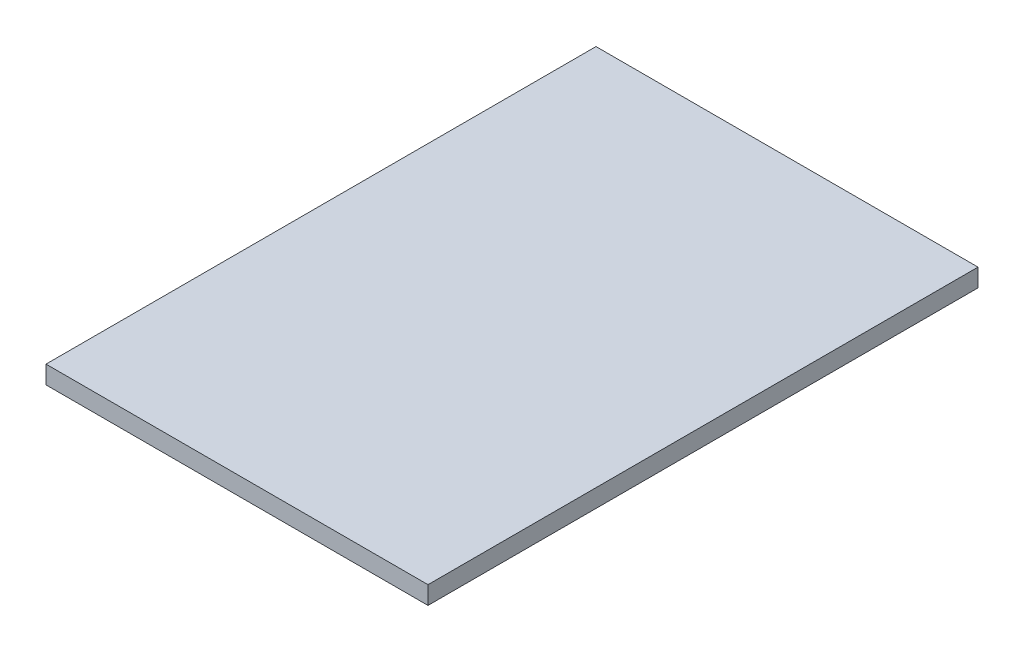
ISO-10303-21;
HEADER;
FILE_DESCRIPTION(('STEP AP214'),'2;1');
FILE_NAME('part.step','',(''),(''),'','','');
FILE_SCHEMA(('AUTOMOTIVE_DESIGN { 1 0 10303 214 1 1 1 1 }'));
ENDSEC;
DATA;
#1=APPLICATION_CONTEXT('core data for automotive mechanical design processes');
#2=APPLICATION_PROTOCOL_DEFINITION('international standard','automotive_design',2000,#1);
#3=PRODUCT_CONTEXT('',#1,'mechanical');
#4=PRODUCT('Part','Part','',(#3));
#5=PRODUCT_RELATED_PRODUCT_CATEGORY('part','',(#4));
#6=PRODUCT_DEFINITION_FORMATION('','',#4);
#7=PRODUCT_DEFINITION_CONTEXT('part definition',#1,'design');
#8=PRODUCT_DEFINITION('design','',#6,#7);
#9=PRODUCT_DEFINITION_SHAPE('','',#8);
#10=(LENGTH_UNIT() NAMED_UNIT(*) SI_UNIT(.MILLI.,.METRE.));
#11=(NAMED_UNIT(*) PLANE_ANGLE_UNIT() SI_UNIT($,.RADIAN.));
#12=(NAMED_UNIT(*) SI_UNIT($,.STERADIAN.) SOLID_ANGLE_UNIT());
#13=UNCERTAINTY_MEASURE_WITH_UNIT(LENGTH_MEASURE(1.E-05),#10,'distance_accuracy_value','');
#14=(GEOMETRIC_REPRESENTATION_CONTEXT(3) GLOBAL_UNCERTAINTY_ASSIGNED_CONTEXT((#13)) GLOBAL_UNIT_ASSIGNED_CONTEXT((#10,
#11,#12)) REPRESENTATION_CONTEXT('',''));
#15=CARTESIAN_POINT('',(0.,0.,0.));
#16=DIRECTION('',(0.,0.,1.));
#17=DIRECTION('',(1.,0.,0.));
#18=AXIS2_PLACEMENT_3D('',#15,#16,#17);
#19=CARTESIAN_POINT('',(191.,18.,-275.));
#20=DIRECTION('',(-1.,0.,0.));
#21=DIRECTION('',(0.,0.,1.));
#22=AXIS2_PLACEMENT_3D('',#19,#20,#21);
#23=PLANE('',#22);
#24=DIRECTION('',(0.,0.,-1.));
#25=VECTOR('',#24,1.);
#26=CARTESIAN_POINT('',(191.,0.,-275.));
#27=LINE('',#26,#25);
#28=CARTESIAN_POINT('',(191.,0.,275.));
#29=VERTEX_POINT('',#28);
#30=CARTESIAN_POINT('',(191.,0.,-275.));
#31=VERTEX_POINT('',#30);
#32=EDGE_CURVE('E96',#29,#31,#27,.T.);
#33=ORIENTED_EDGE('',*,*,#32,.T.);
#34=DIRECTION('',(0.,-1.,0.));
#35=VECTOR('',#34,1.);
#36=CARTESIAN_POINT('',(191.,18.,-275.));
#37=LINE('',#36,#35);
#38=CARTESIAN_POINT('',(191.,18.,-275.));
#39=VERTEX_POINT('',#38);
#40=EDGE_CURVE('E11',#39,#31,#37,.T.);
#41=ORIENTED_EDGE('',*,*,#40,.F.);
#42=DIRECTION('',(0.,0.,-1.));
#43=VECTOR('',#42,1.);
#44=CARTESIAN_POINT('',(191.,18.,-275.));
#45=LINE('',#44,#43);
#46=CARTESIAN_POINT('',(191.,18.,275.));
#47=VERTEX_POINT('',#46);
#48=EDGE_CURVE('E84',#47,#39,#45,.T.);
#49=ORIENTED_EDGE('',*,*,#48,.F.);
#50=DIRECTION('',(0.,-1.,0.));
#51=VECTOR('',#50,1.);
#52=CARTESIAN_POINT('',(191.,18.,275.));
#53=LINE('',#52,#51);
#54=EDGE_CURVE('E92',#47,#29,#53,.T.);
#55=ORIENTED_EDGE('',*,*,#54,.T.);
#56=EDGE_LOOP('',(#33,#41,#49,#55));
#57=FACE_BOUND('',#56,.T.);
#58=ADVANCED_FACE('F33',(#57),#23,.F.);
#59=CARTESIAN_POINT('',(-191.,18.,-275.));
#60=DIRECTION('',(0.,0.,1.));
#61=DIRECTION('',(1.,0.,0.));
#62=AXIS2_PLACEMENT_3D('',#59,#60,#61);
#63=PLANE('',#62);
#64=DIRECTION('',(-1.,0.,0.));
#65=VECTOR('',#64,1.);
#66=CARTESIAN_POINT('',(-191.,0.,-275.));
#67=LINE('',#66,#65);
#68=CARTESIAN_POINT('',(-191.,0.,-275.));
#69=VERTEX_POINT('',#68);
#70=EDGE_CURVE('E88',#31,#69,#67,.T.);
#71=ORIENTED_EDGE('',*,*,#70,.T.);
#72=DIRECTION('',(0.,-1.,0.));
#73=VECTOR('',#72,1.);
#74=CARTESIAN_POINT('',(-191.,18.,-275.));
#75=LINE('',#74,#73);
#76=CARTESIAN_POINT('',(-191.,18.,-275.));
#77=VERTEX_POINT('',#76);
#78=EDGE_CURVE('E41',#77,#69,#75,.T.);
#79=ORIENTED_EDGE('',*,*,#78,.F.);
#80=DIRECTION('',(-1.,0.,0.));
#81=VECTOR('',#80,1.);
#82=CARTESIAN_POINT('',(-191.,18.,-275.));
#83=LINE('',#82,#81);
#84=EDGE_CURVE('E79',#39,#77,#83,.T.);
#85=ORIENTED_EDGE('',*,*,#84,.F.);
#86=ORIENTED_EDGE('',*,*,#40,.T.);
#87=EDGE_LOOP('',(#71,#79,#85,#86));
#88=FACE_BOUND('',#87,.T.);
#89=ADVANCED_FACE('F87',(#88),#63,.F.);
#90=CARTESIAN_POINT('',(-191.,18.,-275.));
#91=DIRECTION('',(1.,0.,0.));
#92=DIRECTION('',(0.,0.,-1.));
#93=AXIS2_PLACEMENT_3D('',#90,#91,#92);
#94=PLANE('',#93);
#95=DIRECTION('',(0.,0.,1.));
#96=VECTOR('',#95,1.);
#97=CARTESIAN_POINT('',(-191.,0.,-275.));
#98=LINE('',#97,#96);
#99=CARTESIAN_POINT('',(-191.,0.,275.));
#100=VERTEX_POINT('',#99);
#101=EDGE_CURVE('E66',#69,#100,#98,.T.);
#102=ORIENTED_EDGE('',*,*,#101,.T.);
#103=DIRECTION('',(0.,-1.,0.));
#104=VECTOR('',#103,1.);
#105=CARTESIAN_POINT('',(-191.,18.,275.));
#106=LINE('',#105,#104);
#107=CARTESIAN_POINT('',(-191.,18.,275.));
#108=VERTEX_POINT('',#107);
#109=EDGE_CURVE('E89',#108,#100,#106,.T.);
#110=ORIENTED_EDGE('',*,*,#109,.F.);
#111=DIRECTION('',(0.,0.,1.));
#112=VECTOR('',#111,1.);
#113=CARTESIAN_POINT('',(-191.,18.,-275.));
#114=LINE('',#113,#112);
#115=EDGE_CURVE('E82',#77,#108,#114,.T.);
#116=ORIENTED_EDGE('',*,*,#115,.F.);
#117=ORIENTED_EDGE('',*,*,#78,.T.);
#118=EDGE_LOOP('',(#102,#110,#116,#117));
#119=FACE_BOUND('',#118,.T.);
#120=ADVANCED_FACE('F90',(#119),#94,.F.);
#121=CARTESIAN_POINT('',(-191.,18.,275.));
#122=DIRECTION('',(0.,0.,-1.));
#123=DIRECTION('',(-1.,0.,0.));
#124=AXIS2_PLACEMENT_3D('',#121,#122,#123);
#125=PLANE('',#124);
#126=DIRECTION('',(1.,0.,0.));
#127=VECTOR('',#126,1.);
#128=CARTESIAN_POINT('',(-191.,0.,275.));
#129=LINE('',#128,#127);
#130=EDGE_CURVE('E72',#100,#29,#129,.T.);
#131=ORIENTED_EDGE('',*,*,#130,.T.);
#132=ORIENTED_EDGE('',*,*,#54,.F.);
#133=DIRECTION('',(1.,0.,0.));
#134=VECTOR('',#133,1.);
#135=CARTESIAN_POINT('',(-191.,18.,275.));
#136=LINE('',#135,#134);
#137=EDGE_CURVE('E49',#108,#47,#136,.T.);
#138=ORIENTED_EDGE('',*,*,#137,.F.);
#139=ORIENTED_EDGE('',*,*,#109,.T.);
#140=EDGE_LOOP('',(#131,#132,#138,#139));
#141=FACE_BOUND('',#140,.T.);
#142=ADVANCED_FACE('F103',(#141),#125,.F.);
#143=CARTESIAN_POINT('',(0.,18.,0.));
#144=DIRECTION('',(0.,1.,0.));
#145=DIRECTION('',(0.,0.,1.));
#146=AXIS2_PLACEMENT_3D('',#143,#144,#145);
#147=PLANE('',#146);
#148=ORIENTED_EDGE('',*,*,#48,.T.);
#149=ORIENTED_EDGE('',*,*,#84,.T.);
#150=ORIENTED_EDGE('',*,*,#115,.T.);
#151=ORIENTED_EDGE('',*,*,#137,.T.);
#152=EDGE_LOOP('',(#148,#149,#150,#151));
#153=FACE_BOUND('',#152,.T.);
#154=ADVANCED_FACE('F80',(#153),#147,.T.);
#155=CARTESIAN_POINT('',(0.,0.,0.));
#156=DIRECTION('',(0.,1.,0.));
#157=DIRECTION('',(0.,0.,1.));
#158=AXIS2_PLACEMENT_3D('',#155,#156,#157);
#159=PLANE('',#158);
#160=ORIENTED_EDGE('',*,*,#32,.F.);
#161=ORIENTED_EDGE('',*,*,#130,.F.);
#162=ORIENTED_EDGE('',*,*,#101,.F.);
#163=ORIENTED_EDGE('',*,*,#70,.F.);
#164=EDGE_LOOP('',(#160,#161,#162,#163));
#165=FACE_BOUND('',#164,.T.);
#166=ADVANCED_FACE('F106',(#165),#159,.F.);
#167=CLOSED_SHELL('',(#58,#89,#120,#142,#154,#166));
#168=MANIFOLD_SOLID_BREP('B2',#167);
#169=ADVANCED_BREP_SHAPE_REPRESENTATION('',(#18,#168),#14);
#170=SHAPE_DEFINITION_REPRESENTATION(#9,#169);
ENDSEC;
END-ISO-10303-21;
